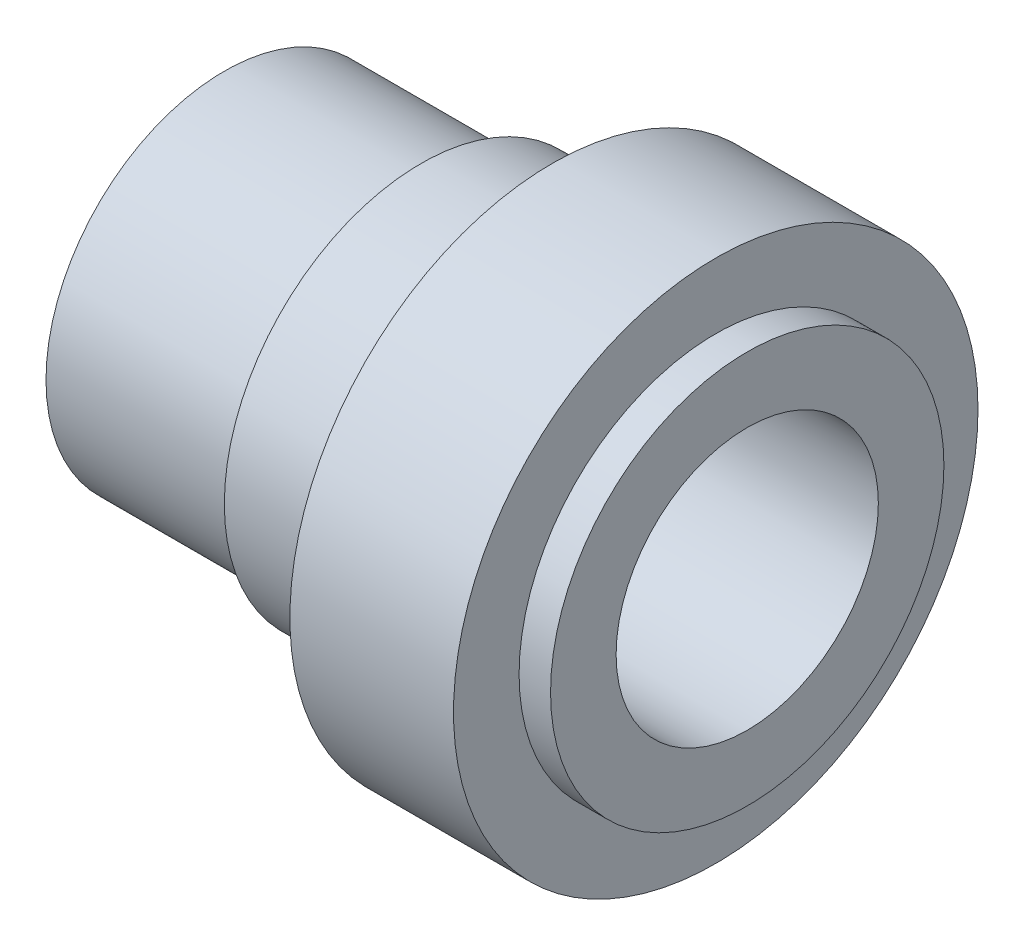
ISO-10303-21;
HEADER;
FILE_DESCRIPTION(('STEP AP214'),'2;1');
FILE_NAME('part.step','',(''),(''),'','','');
FILE_SCHEMA(('AUTOMOTIVE_DESIGN { 1 0 10303 214 1 1 1 1 }'));
ENDSEC;
DATA;
#1=APPLICATION_CONTEXT('core data for automotive mechanical design processes');
#2=APPLICATION_PROTOCOL_DEFINITION('international standard','automotive_design',2000,#1);
#3=PRODUCT_CONTEXT('',#1,'mechanical');
#4=PRODUCT('Part','Part','',(#3));
#5=PRODUCT_RELATED_PRODUCT_CATEGORY('part','',(#4));
#6=PRODUCT_DEFINITION_FORMATION('','',#4);
#7=PRODUCT_DEFINITION_CONTEXT('part definition',#1,'design');
#8=PRODUCT_DEFINITION('design','',#6,#7);
#9=PRODUCT_DEFINITION_SHAPE('','',#8);
#10=(LENGTH_UNIT() NAMED_UNIT(*) SI_UNIT(.MILLI.,.METRE.));
#11=(NAMED_UNIT(*) PLANE_ANGLE_UNIT() SI_UNIT($,.RADIAN.));
#12=(NAMED_UNIT(*) SI_UNIT($,.STERADIAN.) SOLID_ANGLE_UNIT());
#13=UNCERTAINTY_MEASURE_WITH_UNIT(LENGTH_MEASURE(1.E-05),#10,'distance_accuracy_value','');
#14=(GEOMETRIC_REPRESENTATION_CONTEXT(3) GLOBAL_UNCERTAINTY_ASSIGNED_CONTEXT((#13)) GLOBAL_UNIT_ASSIGNED_CONTEXT((#10,
#11,#12)) REPRESENTATION_CONTEXT('',''));
#15=CARTESIAN_POINT('',(0.,0.,0.));
#16=DIRECTION('',(0.,0.,1.));
#17=DIRECTION('',(1.,0.,0.));
#18=AXIS2_PLACEMENT_3D('',#15,#16,#17);
#19=CARTESIAN_POINT('',(7.9248,0.,0.));
#20=DIRECTION('',(-1.,0.,0.));
#21=DIRECTION('',(0.,0.,1.));
#22=AXIS2_PLACEMENT_3D('',#19,#20,#21);
#23=CYLINDRICAL_SURFACE('',#22,12.7);
#24=CARTESIAN_POINT('',(7.9248,0.,0.));
#25=DIRECTION('',(1.,0.,0.));
#26=DIRECTION('',(0.,0.,-1.));
#27=AXIS2_PLACEMENT_3D('',#24,#25,#26);
#28=CIRCLE('',#27,12.7);
#29=CARTESIAN_POINT('',(7.9248,0.,-12.7));
#30=VERTEX_POINT('',#29);
#31=EDGE_CURVE('E66',#30,#30,#28,.T.);
#32=ORIENTED_EDGE('',*,*,#31,.F.);
#33=EDGE_LOOP('',(#32));
#34=FACE_BOUND('',#33,.T.);
#35=CARTESIAN_POINT('',(0.,0.,0.));
#36=DIRECTION('',(1.,0.,0.));
#37=DIRECTION('',(0.,0.,-1.));
#38=AXIS2_PLACEMENT_3D('',#35,#36,#37);
#39=CIRCLE('',#38,12.7);
#40=CARTESIAN_POINT('',(0.,0.,-12.7));
#41=VERTEX_POINT('',#40);
#42=EDGE_CURVE('E44',#41,#41,#39,.T.);
#43=ORIENTED_EDGE('',*,*,#42,.T.);
#44=EDGE_LOOP('',(#43));
#45=FACE_BOUND('',#44,.T.);
#46=ADVANCED_FACE('F41',(#34,#45),#23,.T.);
#47=CARTESIAN_POINT('',(7.9248,0.,0.));
#48=DIRECTION('',(1.,0.,0.));
#49=DIRECTION('',(0.,0.,-1.));
#50=AXIS2_PLACEMENT_3D('',#47,#48,#49);
#51=PLANE('',#50);
#52=CARTESIAN_POINT('',(7.9248,0.,0.));
#53=DIRECTION('',(1.,0.,0.));
#54=DIRECTION('',(0.,0.,-1.));
#55=AXIS2_PLACEMENT_3D('',#52,#53,#54);
#56=CIRCLE('',#55,9.525);
#57=CARTESIAN_POINT('',(7.9248,0.,9.525));
#58=VERTEX_POINT('',#57);
#59=EDGE_CURVE('E53',#58,#58,#56,.T.);
#60=ORIENTED_EDGE('',*,*,#59,.F.);
#61=EDGE_LOOP('',(#60));
#62=FACE_BOUND('',#61,.T.);
#63=ORIENTED_EDGE('',*,*,#31,.T.);
#64=EDGE_LOOP('',(#63));
#65=FACE_BOUND('',#64,.T.);
#66=ADVANCED_FACE('F77',(#62,#65),#51,.T.);
#67=CARTESIAN_POINT('',(0.,0.,0.));
#68=DIRECTION('',(1.,0.,0.));
#69=DIRECTION('',(0.,0.,-1.));
#70=AXIS2_PLACEMENT_3D('',#67,#68,#69);
#71=PLANE('',#70);
#72=CARTESIAN_POINT('',(0.,0.,0.));
#73=DIRECTION('',(-1.,0.,0.));
#74=DIRECTION('',(0.,0.,1.));
#75=AXIS2_PLACEMENT_3D('',#72,#73,#74);
#76=CIRCLE('',#75,9.525);
#77=CARTESIAN_POINT('',(0.,0.,9.525));
#78=VERTEX_POINT('',#77);
#79=EDGE_CURVE('E48',#78,#78,#76,.T.);
#80=ORIENTED_EDGE('',*,*,#79,.F.);
#81=EDGE_LOOP('',(#80));
#82=FACE_BOUND('',#81,.T.);
#83=ORIENTED_EDGE('',*,*,#42,.F.);
#84=EDGE_LOOP('',(#83));
#85=FACE_BOUND('',#84,.T.);
#86=ADVANCED_FACE('F74',(#82,#85),#71,.F.);
#87=CARTESIAN_POINT('',(9.4488,0.,0.));
#88=DIRECTION('',(-1.,0.,0.));
#89=DIRECTION('',(0.,0.,1.));
#90=AXIS2_PLACEMENT_3D('',#87,#88,#89);
#91=CYLINDRICAL_SURFACE('',#90,9.525);
#92=CARTESIAN_POINT('',(9.4488,0.,0.));
#93=DIRECTION('',(1.,0.,0.));
#94=DIRECTION('',(0.,0.,-1.));
#95=AXIS2_PLACEMENT_3D('',#92,#93,#94);
#96=CIRCLE('',#95,9.525);
#97=CARTESIAN_POINT('',(9.4488,0.,9.525));
#98=VERTEX_POINT('',#97);
#99=EDGE_CURVE('E61',#98,#98,#96,.T.);
#100=CARTESIAN_POINT('',(9.4488,0.,9.525));
#101=CARTESIAN_POINT('',(9.432925,0.,9.525));
#102=CARTESIAN_POINT('',(9.41705,0.,9.525));
#103=CARTESIAN_POINT('',(9.3853,0.,9.525));
#104=CARTESIAN_POINT('',(9.369425,0.,9.525));
#105=CARTESIAN_POINT('',(9.337675,0.,9.525));
#106=CARTESIAN_POINT('',(9.3218,0.,9.525));
#107=CARTESIAN_POINT('',(9.29005,0.,9.525));
#108=CARTESIAN_POINT('',(9.274175,0.,9.525));
#109=CARTESIAN_POINT('',(9.242425,0.,9.525));
#110=CARTESIAN_POINT('',(9.22655,0.,9.525));
#111=CARTESIAN_POINT('',(9.1948,0.,9.525));
#112=CARTESIAN_POINT('',(9.178925,0.,9.525));
#113=CARTESIAN_POINT('',(9.147175,0.,9.525));
#114=CARTESIAN_POINT('',(9.1313,0.,9.525));
#115=CARTESIAN_POINT('',(9.09955,0.,9.525));
#116=CARTESIAN_POINT('',(9.083675,0.,9.525));
#117=CARTESIAN_POINT('',(9.051925,0.,9.525));
#118=CARTESIAN_POINT('',(9.03605,0.,9.525));
#119=CARTESIAN_POINT('',(9.0043,0.,9.525));
#120=CARTESIAN_POINT('',(8.988425,0.,9.525));
#121=CARTESIAN_POINT('',(8.956675,0.,9.525));
#122=CARTESIAN_POINT('',(8.9408,0.,9.525));
#123=CARTESIAN_POINT('',(8.90905,0.,9.525));
#124=CARTESIAN_POINT('',(8.893175,0.,9.525));
#125=CARTESIAN_POINT('',(8.861425,0.,9.525));
#126=CARTESIAN_POINT('',(8.84555,0.,9.525));
#127=CARTESIAN_POINT('',(8.8138,0.,9.525));
#128=CARTESIAN_POINT('',(8.797925,0.,9.525));
#129=CARTESIAN_POINT('',(8.766175,0.,9.525));
#130=CARTESIAN_POINT('',(8.7503,0.,9.525));
#131=CARTESIAN_POINT('',(8.71855,0.,9.525));
#132=CARTESIAN_POINT('',(8.702675,0.,9.525));
#133=CARTESIAN_POINT('',(8.670925,0.,9.525));
#134=CARTESIAN_POINT('',(8.65505,0.,9.525));
#135=CARTESIAN_POINT('',(8.6233,0.,9.525));
#136=CARTESIAN_POINT('',(8.607425,0.,9.525));
#137=CARTESIAN_POINT('',(8.575675,0.,9.525));
#138=CARTESIAN_POINT('',(8.5598,0.,9.525));
#139=CARTESIAN_POINT('',(8.52805,0.,9.525));
#140=CARTESIAN_POINT('',(8.512175,0.,9.525));
#141=CARTESIAN_POINT('',(8.480425,0.,9.525));
#142=CARTESIAN_POINT('',(8.46455,0.,9.525));
#143=CARTESIAN_POINT('',(8.4328,0.,9.525));
#144=CARTESIAN_POINT('',(8.416925,0.,9.525));
#145=CARTESIAN_POINT('',(8.385175,0.,9.525));
#146=CARTESIAN_POINT('',(8.3693,0.,9.525));
#147=CARTESIAN_POINT('',(8.33755,0.,9.525));
#148=CARTESIAN_POINT('',(8.321675,0.,9.525));
#149=CARTESIAN_POINT('',(8.289925,0.,9.525));
#150=CARTESIAN_POINT('',(8.27405,0.,9.525));
#151=CARTESIAN_POINT('',(8.2423,0.,9.525));
#152=CARTESIAN_POINT('',(8.226425,0.,9.525));
#153=CARTESIAN_POINT('',(8.194675,0.,9.525));
#154=CARTESIAN_POINT('',(8.1788,0.,9.525));
#155=CARTESIAN_POINT('',(8.14705,0.,9.525));
#156=CARTESIAN_POINT('',(8.131175,0.,9.525));
#157=CARTESIAN_POINT('',(8.099425,0.,9.525));
#158=CARTESIAN_POINT('',(8.08355,0.,9.525));
#159=CARTESIAN_POINT('',(8.0518,0.,9.525));
#160=CARTESIAN_POINT('',(8.035925,0.,9.525));
#161=CARTESIAN_POINT('',(8.004175,0.,9.525));
#162=CARTESIAN_POINT('',(7.9883,0.,9.525));
#163=CARTESIAN_POINT('',(7.95655,0.,9.525));
#164=CARTESIAN_POINT('',(7.940675,0.,9.525));
#165=CARTESIAN_POINT('',(7.9248,0.,9.525));
#166=B_SPLINE_CURVE_WITH_KNOTS('',3,(#100,#101,#102,#103,#104,#105,#106,#107,#108,#109,#110,
#111,#112,#113,#114,#115,#116,#117,#118,#119,#120,#121,#122,#123,#124,#125,#126,#127,#128,#129,
#130,#131,#132,#133,#134,#135,#136,#137,#138,#139,#140,#141,#142,#143,#144,#145,#146,#147,#148,
#149,#150,#151,#152,#153,#154,#155,#156,#157,#158,#159,#160,#161,#162,#163,#164,#165),
.UNSPECIFIED.,.F.,.F.,(4,2,2,2,2,2,2,2,2,2,2,2,2,2,2,2,2,2,2,2,2,2,2,2,2,2,2,2,2,2,2,2,4),(0.,
0.0476250000000008,0.0952500000000016,0.142875000000001,0.190500000000001,0.238125,
0.285750000000001,0.333375,0.381000000000001,0.428625,0.476250000000001,0.523875,
0.571500000000001,0.619125,0.666750000000001,0.714375000000001,0.762000000000001,
0.809625000000001,0.85725,0.904875000000001,0.9525,1.000125,1.04775,1.095375,1.143,1.190625,
1.23825,1.285875,1.3335,1.381125,1.42875,1.476375,1.524),.UNSPECIFIED.);
#167=EDGE_CURVE('BSEAM76',#98,#58,#166,.T.);
#168=ORIENTED_EDGE('',*,*,#99,.F.);
#169=ORIENTED_EDGE('',*,*,#59,.T.);
#170=ORIENTED_EDGE('',*,*,#167,.T.);
#171=ORIENTED_EDGE('',*,*,#167,.F.);
#172=EDGE_LOOP('',(#168,#170,#169,#171));
#173=FACE_BOUND('',#172,.T.);
#174=ADVANCED_FACE('F76',(#173),#91,.T.);
#175=CARTESIAN_POINT('',(9.4488,0.,0.));
#176=DIRECTION('',(1.,0.,0.));
#177=DIRECTION('',(0.,0.,-1.));
#178=AXIS2_PLACEMENT_3D('',#175,#176,#177);
#179=PLANE('',#178);
#180=CARTESIAN_POINT('',(9.4488,0.,0.));
#181=DIRECTION('',(1.,0.,0.));
#182=DIRECTION('',(0.,0.,-1.));
#183=AXIS2_PLACEMENT_3D('',#180,#181,#182);
#184=CIRCLE('',#183,6.35);
#185=CARTESIAN_POINT('',(9.4488,0.,-6.35));
#186=VERTEX_POINT('',#185);
#187=EDGE_CURVE('E172',#186,#186,#184,.T.);
#188=ORIENTED_EDGE('',*,*,#187,.F.);
#189=EDGE_LOOP('',(#188));
#190=FACE_BOUND('',#189,.T.);
#191=ORIENTED_EDGE('',*,*,#99,.T.);
#192=EDGE_LOOP('',(#191));
#193=FACE_BOUND('',#192,.T.);
#194=ADVANCED_FACE('F83',(#190,#193),#179,.T.);
#195=CARTESIAN_POINT('',(-6.35,0.,0.));
#196=DIRECTION('',(1.,0.,0.));
#197=DIRECTION('',(0.,0.,-1.));
#198=AXIS2_PLACEMENT_3D('',#195,#196,#197);
#199=CYLINDRICAL_SURFACE('',#198,9.525);
#200=CARTESIAN_POINT('',(-6.35,0.,0.));
#201=DIRECTION('',(-1.,0.,0.));
#202=DIRECTION('',(0.,0.,1.));
#203=AXIS2_PLACEMENT_3D('',#200,#201,#202);
#204=CIRCLE('',#203,9.525);
#205=CARTESIAN_POINT('',(-6.35,0.,9.525));
#206=VERTEX_POINT('',#205);
#207=EDGE_CURVE('E59',#206,#206,#204,.T.);
#208=ORIENTED_EDGE('',*,*,#207,.F.);
#209=EDGE_LOOP('',(#208));
#210=FACE_BOUND('',#209,.T.);
#211=ORIENTED_EDGE('',*,*,#79,.T.);
#212=EDGE_LOOP('',(#211));
#213=FACE_BOUND('',#212,.T.);
#214=ADVANCED_FACE('F117',(#210,#213),#199,.T.);
#215=CARTESIAN_POINT('',(-6.35,0.,0.));
#216=DIRECTION('',(-1.,0.,0.));
#217=DIRECTION('',(0.,0.,1.));
#218=AXIS2_PLACEMENT_3D('',#215,#216,#217);
#219=PLANE('',#218);
#220=CARTESIAN_POINT('',(-6.35,0.,0.));
#221=DIRECTION('',(-1.,0.,0.));
#222=DIRECTION('',(0.,0.,1.));
#223=AXIS2_PLACEMENT_3D('',#220,#221,#222);
#224=CIRCLE('',#223,8.636);
#225=CARTESIAN_POINT('',(-6.35,0.,-8.636));
#226=VERTEX_POINT('',#225);
#227=EDGE_CURVE('E10',#226,#226,#224,.T.);
#228=ORIENTED_EDGE('',*,*,#227,.F.);
#229=EDGE_LOOP('',(#228));
#230=FACE_BOUND('',#229,.T.);
#231=ORIENTED_EDGE('',*,*,#207,.T.);
#232=EDGE_LOOP('',(#231));
#233=FACE_BOUND('',#232,.T.);
#234=ADVANCED_FACE('F128',(#230,#233),#219,.T.);
#235=CARTESIAN_POINT('',(-15.875,0.,0.));
#236=DIRECTION('',(1.,0.,0.));
#237=DIRECTION('',(0.,0.,-1.));
#238=AXIS2_PLACEMENT_3D('',#235,#236,#237);
#239=CYLINDRICAL_SURFACE('',#238,8.636);
#240=CARTESIAN_POINT('',(-15.875,0.,0.));
#241=DIRECTION('',(-1.,0.,0.));
#242=DIRECTION('',(0.,0.,1.));
#243=AXIS2_PLACEMENT_3D('',#240,#241,#242);
#244=CIRCLE('',#243,8.636);
#245=CARTESIAN_POINT('',(-15.875,0.,-8.636));
#246=VERTEX_POINT('',#245);
#247=EDGE_CURVE('E57',#246,#246,#244,.T.);
#248=CARTESIAN_POINT('',(-15.875,0.,-8.636));
#249=CARTESIAN_POINT('',(-15.77578125,0.,-8.636));
#250=CARTESIAN_POINT('',(-15.6765625,0.,-8.636));
#251=CARTESIAN_POINT('',(-15.478125,0.,-8.636));
#252=CARTESIAN_POINT('',(-15.37890625,0.,-8.636));
#253=CARTESIAN_POINT('',(-15.18046875,0.,-8.636));
#254=CARTESIAN_POINT('',(-15.08125,0.,-8.636));
#255=CARTESIAN_POINT('',(-14.8828125,0.,-8.636));
#256=CARTESIAN_POINT('',(-14.78359375,0.,-8.636));
#257=CARTESIAN_POINT('',(-14.58515625,0.,-8.636));
#258=CARTESIAN_POINT('',(-14.4859375,0.,-8.636));
#259=CARTESIAN_POINT('',(-14.2875,0.,-8.636));
#260=CARTESIAN_POINT('',(-14.18828125,0.,-8.636));
#261=CARTESIAN_POINT('',(-13.98984375,0.,-8.636));
#262=CARTESIAN_POINT('',(-13.890625,0.,-8.636));
#263=CARTESIAN_POINT('',(-13.6921875,0.,-8.636));
#264=CARTESIAN_POINT('',(-13.59296875,0.,-8.636));
#265=CARTESIAN_POINT('',(-13.39453125,0.,-8.636));
#266=CARTESIAN_POINT('',(-13.2953125,0.,-8.636));
#267=CARTESIAN_POINT('',(-13.096875,0.,-8.636));
#268=CARTESIAN_POINT('',(-12.99765625,0.,-8.636));
#269=CARTESIAN_POINT('',(-12.79921875,0.,-8.636));
#270=CARTESIAN_POINT('',(-12.7,0.,-8.636));
#271=CARTESIAN_POINT('',(-12.5015625,0.,-8.636));
#272=CARTESIAN_POINT('',(-12.40234375,0.,-8.636));
#273=CARTESIAN_POINT('',(-12.20390625,0.,-8.636));
#274=CARTESIAN_POINT('',(-12.1046875,0.,-8.636));
#275=CARTESIAN_POINT('',(-11.90625,0.,-8.636));
#276=CARTESIAN_POINT('',(-11.80703125,0.,-8.636));
#277=CARTESIAN_POINT('',(-11.60859375,0.,-8.636));
#278=CARTESIAN_POINT('',(-11.509375,0.,-8.636));
#279=CARTESIAN_POINT('',(-11.3109375,0.,-8.636));
#280=CARTESIAN_POINT('',(-11.21171875,0.,-8.636));
#281=CARTESIAN_POINT('',(-11.01328125,0.,-8.636));
#282=CARTESIAN_POINT('',(-10.9140625,0.,-8.636));
#283=CARTESIAN_POINT('',(-10.715625,0.,-8.636));
#284=CARTESIAN_POINT('',(-10.61640625,0.,-8.636));
#285=CARTESIAN_POINT('',(-10.41796875,0.,-8.636));
#286=CARTESIAN_POINT('',(-10.31875,0.,-8.636));
#287=CARTESIAN_POINT('',(-10.1203125,0.,-8.636));
#288=CARTESIAN_POINT('',(-10.02109375,0.,-8.636));
#289=CARTESIAN_POINT('',(-9.82265625,0.,-8.636));
#290=CARTESIAN_POINT('',(-9.7234375,0.,-8.636));
#291=CARTESIAN_POINT('',(-9.525,0.,-8.636));
#292=CARTESIAN_POINT('',(-9.42578125,0.,-8.636));
#293=CARTESIAN_POINT('',(-9.22734375,0.,-8.636));
#294=CARTESIAN_POINT('',(-9.128125,0.,-8.636));
#295=CARTESIAN_POINT('',(-8.9296875,0.,-8.636));
#296=CARTESIAN_POINT('',(-8.83046875,0.,-8.636));
#297=CARTESIAN_POINT('',(-8.63203125,0.,-8.636));
#298=CARTESIAN_POINT('',(-8.5328125,0.,-8.636));
#299=CARTESIAN_POINT('',(-8.334375,0.,-8.636));
#300=CARTESIAN_POINT('',(-8.23515625,0.,-8.636));
#301=CARTESIAN_POINT('',(-8.03671875,0.,-8.636));
#302=CARTESIAN_POINT('',(-7.9375,0.,-8.636));
#303=CARTESIAN_POINT('',(-7.7390625,0.,-8.636));
#304=CARTESIAN_POINT('',(-7.63984375,0.,-8.636));
#305=CARTESIAN_POINT('',(-7.44140625,0.,-8.636));
#306=CARTESIAN_POINT('',(-7.3421875,0.,-8.636));
#307=CARTESIAN_POINT('',(-7.14375,0.,-8.636));
#308=CARTESIAN_POINT('',(-7.04453125,0.,-8.636));
#309=CARTESIAN_POINT('',(-6.84609375,0.,-8.636));
#310=CARTESIAN_POINT('',(-6.746875,0.,-8.636));
#311=CARTESIAN_POINT('',(-6.5484375,0.,-8.636));
#312=CARTESIAN_POINT('',(-6.44921875,0.,-8.636));
#313=CARTESIAN_POINT('',(-6.35,0.,-8.636));
#314=B_SPLINE_CURVE_WITH_KNOTS('',3,(#248,#249,#250,#251,#252,#253,#254,#255,#256,#257,#258,
#259,#260,#261,#262,#263,#264,#265,#266,#267,#268,#269,#270,#271,#272,#273,#274,#275,#276,#277,
#278,#279,#280,#281,#282,#283,#284,#285,#286,#287,#288,#289,#290,#291,#292,#293,#294,#295,#296,
#297,#298,#299,#300,#301,#302,#303,#304,#305,#306,#307,#308,#309,#310,#311,#312,#313),
.UNSPECIFIED.,.F.,.F.,(4,2,2,2,2,2,2,2,2,2,2,2,2,2,2,2,2,2,2,2,2,2,2,2,2,2,2,2,2,2,2,2,4),(0.,
0.297656249999998,0.595312499999999,0.892968749999999,1.190625,1.48828125,1.7859375,2.08359375,
2.38125,2.67890625,2.9765625,3.27421875,3.571875,3.86953125,4.1671875,4.46484375,4.7625,
5.06015625,5.3578125,5.65546875,5.953125,6.25078125,6.5484375,6.84609375,7.14375,7.44140625,
7.7390625,8.03671875,8.334375,8.63203125,8.9296875,9.22734375,9.525),.UNSPECIFIED.);
#315=EDGE_CURVE('BSEAM138',#246,#226,#314,.T.);
#316=ORIENTED_EDGE('',*,*,#247,.F.);
#317=ORIENTED_EDGE('',*,*,#227,.T.);
#318=ORIENTED_EDGE('',*,*,#315,.T.);
#319=ORIENTED_EDGE('',*,*,#315,.F.);
#320=EDGE_LOOP('',(#316,#318,#317,#319));
#321=FACE_BOUND('',#320,.T.);
#322=ADVANCED_FACE('F138',(#321),#239,.T.);
#323=CARTESIAN_POINT('',(-15.875,0.,0.));
#324=DIRECTION('',(-1.,0.,0.));
#325=DIRECTION('',(0.,0.,1.));
#326=AXIS2_PLACEMENT_3D('',#323,#324,#325);
#327=PLANE('',#326);
#328=CARTESIAN_POINT('',(-15.875,0.,0.));
#329=DIRECTION('',(-1.,0.,0.));
#330=DIRECTION('',(0.,0.,1.));
#331=AXIS2_PLACEMENT_3D('',#328,#329,#330);
#332=CIRCLE('',#331,6.35);
#333=CARTESIAN_POINT('',(-15.875,0.,6.35));
#334=VERTEX_POINT('',#333);
#335=EDGE_CURVE('E175',#334,#334,#332,.T.);
#336=ORIENTED_EDGE('',*,*,#335,.F.);
#337=EDGE_LOOP('',(#336));
#338=FACE_BOUND('',#337,.T.);
#339=ORIENTED_EDGE('',*,*,#247,.T.);
#340=EDGE_LOOP('',(#339));
#341=FACE_BOUND('',#340,.T.);
#342=ADVANCED_FACE('F147',(#338,#341),#327,.T.);
#343=CARTESIAN_POINT('',(9.525,0.,0.));
#344=DIRECTION('',(-1.,0.,0.));
#345=DIRECTION('',(0.,0.,1.));
#346=AXIS2_PLACEMENT_3D('',#343,#344,#345);
#347=CYLINDRICAL_SURFACE('',#346,6.35);
#348=ORIENTED_EDGE('',*,*,#187,.T.);
#349=EDGE_LOOP('',(#348));
#350=FACE_BOUND('',#349,.T.);
#351=ORIENTED_EDGE('',*,*,#335,.T.);
#352=EDGE_LOOP('',(#351));
#353=FACE_BOUND('',#352,.T.);
#354=ADVANCED_FACE('F156',(#350,#353),#347,.F.);
#355=CLOSED_SHELL('',(#46,#66,#86,#174,#194,#214,#234,#322,#342,#354));
#356=MANIFOLD_SOLID_BREP('B2',#355);
#357=ADVANCED_BREP_SHAPE_REPRESENTATION('',(#18,#356),#14);
#358=SHAPE_DEFINITION_REPRESENTATION(#9,#357);
ENDSEC;
END-ISO-10303-21;
